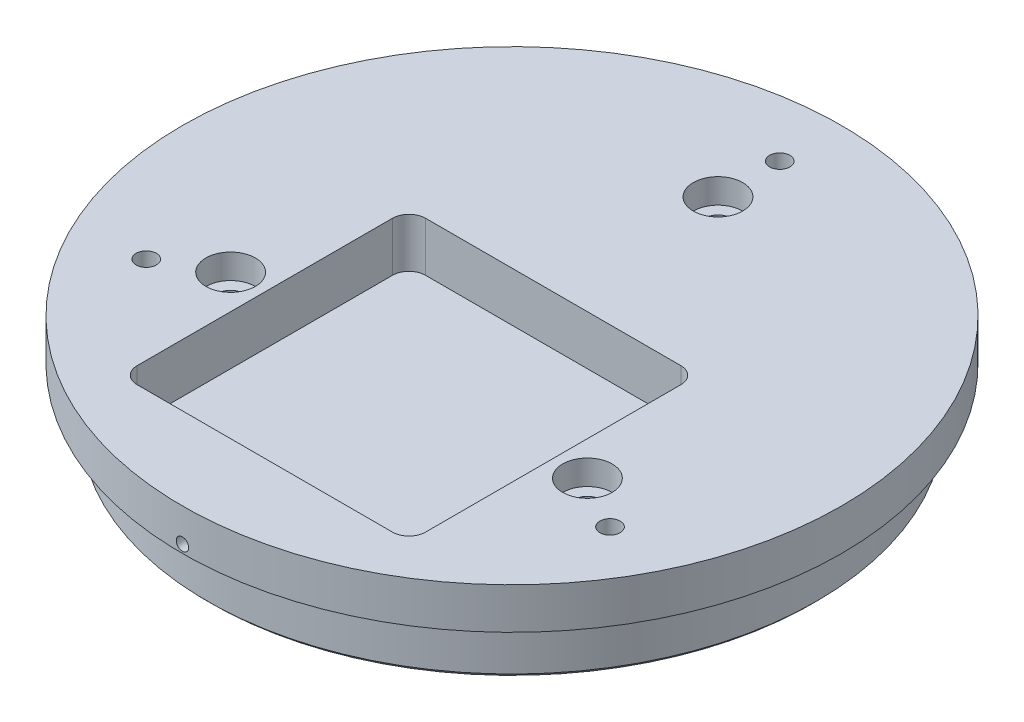
ISO-10303-21;
HEADER;
FILE_DESCRIPTION(('STEP AP214'),'2;1');
FILE_NAME('part.step','',(''),(''),'','','');
FILE_SCHEMA(('AUTOMOTIVE_DESIGN { 1 0 10303 214 1 1 1 1 }'));
ENDSEC;
DATA;
#1=APPLICATION_CONTEXT('core data for automotive mechanical design processes');
#2=APPLICATION_PROTOCOL_DEFINITION('international standard','automotive_design',2000,#1);
#3=PRODUCT_CONTEXT('',#1,'mechanical');
#4=PRODUCT('Part','Part','',(#3));
#5=PRODUCT_RELATED_PRODUCT_CATEGORY('part','',(#4));
#6=PRODUCT_DEFINITION_FORMATION('','',#4);
#7=PRODUCT_DEFINITION_CONTEXT('part definition',#1,'design');
#8=PRODUCT_DEFINITION('design','',#6,#7);
#9=PRODUCT_DEFINITION_SHAPE('','',#8);
#10=(LENGTH_UNIT() NAMED_UNIT(*) SI_UNIT(.MILLI.,.METRE.));
#11=(NAMED_UNIT(*) PLANE_ANGLE_UNIT() SI_UNIT($,.RADIAN.));
#12=(NAMED_UNIT(*) SI_UNIT($,.STERADIAN.) SOLID_ANGLE_UNIT());
#13=UNCERTAINTY_MEASURE_WITH_UNIT(LENGTH_MEASURE(1.E-05),#10,'distance_accuracy_value','');
#14=(GEOMETRIC_REPRESENTATION_CONTEXT(3) GLOBAL_UNCERTAINTY_ASSIGNED_CONTEXT((#13)) GLOBAL_UNIT_ASSIGNED_CONTEXT((#10,
#11,#12)) REPRESENTATION_CONTEXT('',''));
#15=CARTESIAN_POINT('',(0.,0.,0.));
#16=DIRECTION('',(0.,0.,1.));
#17=DIRECTION('',(1.,0.,0.));
#18=AXIS2_PLACEMENT_3D('',#15,#16,#17);
#19=CARTESIAN_POINT('',(-13.3000000000007,2.00000000069167,26.7499999999995));
#20=DIRECTION('',(0.,1.,0.));
#21=DIRECTION('',(-1.,0.,0.));
#22=AXIS2_PLACEMENT_3D('',#19,#20,#21);
#23=CONICAL_SURFACE('',#22,1.22949999949616,1.02974425750673);
#24=CARTESIAN_POINT('',(-13.3000000000152,1.26124186795096,26.7499999999995));
#25=VERTEX_POINT('',#24);
#26=VERTEX_LOOP('',#25);
#27=FACE_BOUND('',#26,.T.);
#28=CARTESIAN_POINT('',(-13.3000000000007,1.99999999999998,26.7499999999995));
#29=DIRECTION('',(0.,1.,0.));
#30=DIRECTION('',(-1.,0.,0.));
#31=AXIS2_PLACEMENT_3D('',#28,#29,#30);
#32=CIRCLE('',#31,1.2295);
#33=CARTESIAN_POINT('',(-14.5295000000007,1.99999999999998,26.7499999999995));
#34=VERTEX_POINT('',#33);
#35=EDGE_CURVE('E108',#34,#34,#32,.T.);
#36=ORIENTED_EDGE('',*,*,#35,.T.);
#37=EDGE_LOOP('',(#36));
#38=FACE_BOUND('',#37,.T.);
#39=ADVANCED_FACE('F17',(#27,#38),#23,.F.);
#40=CARTESIAN_POINT('',(13.3000000000008,2.00000000069167,-1.85000000000093));
#41=DIRECTION('',(0.,1.,0.));
#42=DIRECTION('',(-1.,0.,0.));
#43=AXIS2_PLACEMENT_3D('',#40,#41,#42);
#44=CONICAL_SURFACE('',#43,1.22949999958183,1.02974425750354);
#45=CARTESIAN_POINT('',(13.3000000000152,1.26124186789411,-1.85000000000093));
#46=VERTEX_POINT('',#45);
#47=VERTEX_LOOP('',#46);
#48=FACE_BOUND('',#47,.T.);
#49=CARTESIAN_POINT('',(13.3000000000008,1.99999999999999,-1.85000000000093));
#50=DIRECTION('',(0.,1.,0.));
#51=DIRECTION('',(-1.,0.,0.));
#52=AXIS2_PLACEMENT_3D('',#49,#50,#51);
#53=CIRCLE('',#52,1.2295);
#54=CARTESIAN_POINT('',(12.0705000000008,1.99999999999999,-1.85000000000093));
#55=VERTEX_POINT('',#54);
#56=EDGE_CURVE('E110',#55,#55,#53,.T.);
#57=ORIENTED_EDGE('',*,*,#56,.T.);
#58=EDGE_LOOP('',(#57));
#59=FACE_BOUND('',#58,.T.);
#60=ADVANCED_FACE('F105',(#48,#59),#44,.F.);
#61=CARTESIAN_POINT('',(-13.3000000000007,3.99999999999998,26.7499999999995));
#62=DIRECTION('',(0.,1.,0.));
#63=DIRECTION('',(-1.,0.,0.));
#64=AXIS2_PLACEMENT_3D('',#61,#62,#63);
#65=CYLINDRICAL_SURFACE('',#64,1.2295);
#66=ORIENTED_EDGE('',*,*,#35,.F.);
#67=EDGE_LOOP('',(#66));
#68=FACE_BOUND('',#67,.T.);
#69=CARTESIAN_POINT('',(-13.3000000000007,5.99999999999998,26.7499999999995));
#70=DIRECTION('',(0.,1.,0.));
#71=DIRECTION('',(-1.,0.,0.));
#72=AXIS2_PLACEMENT_3D('',#69,#70,#71);
#73=CIRCLE('',#72,1.2295);
#74=CARTESIAN_POINT('',(-14.5295000000007,5.99999999999998,26.7499999999995));
#75=VERTEX_POINT('',#74);
#76=EDGE_CURVE('E20',#75,#75,#73,.F.);
#77=ORIENTED_EDGE('',*,*,#76,.F.);
#78=EDGE_LOOP('',(#77));
#79=FACE_BOUND('',#78,.T.);
#80=ADVANCED_FACE('F410',(#68,#79),#65,.F.);
#81=CARTESIAN_POINT('',(13.3000000000008,3.99999999999999,-1.85000000000093));
#82=DIRECTION('',(0.,1.,0.));
#83=DIRECTION('',(-1.,0.,0.));
#84=AXIS2_PLACEMENT_3D('',#81,#82,#83);
#85=CYLINDRICAL_SURFACE('',#84,1.2295);
#86=ORIENTED_EDGE('',*,*,#56,.F.);
#87=EDGE_LOOP('',(#86));
#88=FACE_BOUND('',#87,.T.);
#89=CARTESIAN_POINT('',(13.3000000000008,5.99999999999999,-1.85000000000093));
#90=DIRECTION('',(0.,1.,0.));
#91=DIRECTION('',(-1.,0.,0.));
#92=AXIS2_PLACEMENT_3D('',#89,#90,#91);
#93=CIRCLE('',#92,1.2295);
#94=CARTESIAN_POINT('',(12.0705000000008,5.99999999999999,-1.85000000000093));
#95=VERTEX_POINT('',#94);
#96=EDGE_CURVE('E393',#95,#95,#93,.F.);
#97=ORIENTED_EDGE('',*,*,#96,.F.);
#98=EDGE_LOOP('',(#97));
#99=FACE_BOUND('',#98,.T.);
#100=ADVANCED_FACE('F412',(#88,#99),#85,.F.);
#101=CARTESIAN_POINT('',(28.1458256229943,4.00000000070122,16.25));
#102=DIRECTION('',(0.,1.,0.));
#103=DIRECTION('',(-1.,0.,0.));
#104=AXIS2_PLACEMENT_3D('',#101,#102,#103);
#105=CONICAL_SURFACE('',#104,1.22949999954438,1.02974425746656);
#106=CARTESIAN_POINT('',(28.1458256229143,3.26124186790366,16.25));
#107=VERTEX_POINT('',#106);
#108=VERTEX_LOOP('',#107);
#109=FACE_BOUND('',#108,.T.);
#110=CARTESIAN_POINT('',(28.1458256229943,3.99999999999999,16.25));
#111=DIRECTION('',(0.,1.,0.));
#112=DIRECTION('',(-1.,0.,0.));
#113=AXIS2_PLACEMENT_3D('',#110,#111,#112);
#114=CIRCLE('',#113,1.2295);
#115=CARTESIAN_POINT('',(26.9163256229943,3.99999999999999,16.25));
#116=VERTEX_POINT('',#115);
#117=EDGE_CURVE('E388',#116,#116,#114,.T.);
#118=ORIENTED_EDGE('',*,*,#117,.T.);
#119=EDGE_LOOP('',(#118));
#120=FACE_BOUND('',#119,.T.);
#121=ADVANCED_FACE('F418',(#109,#120),#105,.F.);
#122=CARTESIAN_POINT('',(-28.1458256229943,4.00000000075806,16.25));
#123=DIRECTION('',(0.,1.,0.));
#124=DIRECTION('',(-1.,0.,0.));
#125=AXIS2_PLACEMENT_3D('',#122,#123,#124);
#126=CONICAL_SURFACE('',#125,1.22949999959052,1.02974425746957);
#127=CARTESIAN_POINT('',(-28.1458256229712,3.26124186790366,16.25));
#128=VERTEX_POINT('',#127);
#129=VERTEX_LOOP('',#128);
#130=FACE_BOUND('',#129,.T.);
#131=CARTESIAN_POINT('',(-28.1458256229943,3.99999999999998,16.25));
#132=DIRECTION('',(0.,1.,0.));
#133=DIRECTION('',(-1.,0.,0.));
#134=AXIS2_PLACEMENT_3D('',#131,#132,#133);
#135=CIRCLE('',#134,1.2295);
#136=CARTESIAN_POINT('',(-29.3753256229943,3.99999999999998,16.25));
#137=VERTEX_POINT('',#136);
#138=EDGE_CURVE('E383',#137,#137,#135,.T.);
#139=ORIENTED_EDGE('',*,*,#138,.T.);
#140=EDGE_LOOP('',(#139));
#141=FACE_BOUND('',#140,.T.);
#142=ADVANCED_FACE('F424',(#130,#141),#126,.F.);
#143=CARTESIAN_POINT('',(0.,4.00000000064438,-32.5));
#144=DIRECTION('',(0.,1.,0.));
#145=DIRECTION('',(-1.,0.,0.));
#146=AXIS2_PLACEMENT_3D('',#143,#144,#145);
#147=CONICAL_SURFACE('',#146,1.22949999945378,1.02974425747629);
#148=CARTESIAN_POINT('',(-5.6843418860808E-11,3.26124186790366,-32.5));
#149=VERTEX_POINT('',#148);
#150=VERTEX_LOOP('',#149);
#151=FACE_BOUND('',#150,.T.);
#152=CARTESIAN_POINT('',(0.,3.99999999999999,-32.5));
#153=DIRECTION('',(0.,1.,0.));
#154=DIRECTION('',(-1.,0.,0.));
#155=AXIS2_PLACEMENT_3D('',#152,#153,#154);
#156=CIRCLE('',#155,1.2295);
#157=CARTESIAN_POINT('',(-1.22950000000001,3.99999999999999,-32.5));
#158=VERTEX_POINT('',#157);
#159=EDGE_CURVE('E380',#158,#158,#156,.T.);
#160=ORIENTED_EDGE('',*,*,#159,.T.);
#161=EDGE_LOOP('',(#160));
#162=FACE_BOUND('',#161,.T.);
#163=ADVANCED_FACE('F428',(#151,#162),#147,.F.);
#164=CARTESIAN_POINT('',(0.,5.99999999999999,12.5));
#165=DIRECTION('',(0.,1.,0.));
#166=DIRECTION('',(0.,0.,1.));
#167=AXIS2_PLACEMENT_3D('',#164,#165,#166);
#168=PLANE('',#167);
#169=ORIENTED_EDGE('',*,*,#96,.T.);
#170=EDGE_LOOP('',(#169));
#171=FACE_BOUND('',#170,.T.);
#172=ORIENTED_EDGE('',*,*,#76,.T.);
#173=EDGE_LOOP('',(#172));
#174=FACE_BOUND('',#173,.T.);
#175=CARTESIAN_POINT('',(-15.5,5.99999999999998,-3.));
#176=DIRECTION('',(0.,-1.,0.));
#177=DIRECTION('',(1.,0.,0.));
#178=AXIS2_PLACEMENT_3D('',#175,#176,#177);
#179=CIRCLE('',#178,2.);
#180=CARTESIAN_POINT('',(-15.5,5.99999999999998,-5.));
#181=VERTEX_POINT('',#180);
#182=CARTESIAN_POINT('',(-17.5,5.99999999999998,-3.));
#183=VERTEX_POINT('',#182);
#184=EDGE_CURVE('E367',#181,#183,#179,.F.);
#185=ORIENTED_EDGE('',*,*,#184,.T.);
#186=DIRECTION('',(0.,0.,1.));
#187=VECTOR('',#186,1.);
#188=CARTESIAN_POINT('',(-17.5,5.99999999999998,-5.));
#189=LINE('',#188,#187);
#190=CARTESIAN_POINT('',(-17.5,5.99999999999998,28.));
#191=VERTEX_POINT('',#190);
#192=EDGE_CURVE('E370',#183,#191,#189,.T.);
#193=ORIENTED_EDGE('',*,*,#192,.T.);
#194=CARTESIAN_POINT('',(-15.5,5.99999999999998,28.));
#195=DIRECTION('',(0.,-1.,0.));
#196=DIRECTION('',(1.,0.,0.));
#197=AXIS2_PLACEMENT_3D('',#194,#195,#196);
#198=CIRCLE('',#197,2.);
#199=CARTESIAN_POINT('',(-15.5,5.99999999999998,30.));
#200=VERTEX_POINT('',#199);
#201=EDGE_CURVE('E373',#191,#200,#198,.F.);
#202=ORIENTED_EDGE('',*,*,#201,.T.);
#203=DIRECTION('',(1.,0.,0.));
#204=VECTOR('',#203,1.);
#205=CARTESIAN_POINT('',(-17.5,5.99999999999998,30.));
#206=LINE('',#205,#204);
#207=CARTESIAN_POINT('',(15.5,5.99999999999999,30.));
#208=VERTEX_POINT('',#207);
#209=EDGE_CURVE('E82',#200,#208,#206,.T.);
#210=ORIENTED_EDGE('',*,*,#209,.T.);
#211=CARTESIAN_POINT('',(15.5,5.99999999999999,28.));
#212=DIRECTION('',(0.,-1.,0.));
#213=DIRECTION('',(1.,0.,0.));
#214=AXIS2_PLACEMENT_3D('',#211,#212,#213);
#215=CIRCLE('',#214,2.);
#216=CARTESIAN_POINT('',(17.5,5.99999999999999,28.));
#217=VERTEX_POINT('',#216);
#218=EDGE_CURVE('E379',#208,#217,#215,.F.);
#219=ORIENTED_EDGE('',*,*,#218,.T.);
#220=DIRECTION('',(0.,0.,-1.));
#221=VECTOR('',#220,1.);
#222=CARTESIAN_POINT('',(17.5,5.99999999999999,30.));
#223=LINE('',#222,#221);
#224=CARTESIAN_POINT('',(17.5,5.99999999999999,-3.));
#225=VERTEX_POINT('',#224);
#226=EDGE_CURVE('E88',#217,#225,#223,.T.);
#227=ORIENTED_EDGE('',*,*,#226,.T.);
#228=CARTESIAN_POINT('',(15.5,5.99999999999999,-3.));
#229=DIRECTION('',(0.,-1.,0.));
#230=DIRECTION('',(1.,0.,0.));
#231=AXIS2_PLACEMENT_3D('',#228,#229,#230);
#232=CIRCLE('',#231,2.);
#233=CARTESIAN_POINT('',(15.5,5.99999999999999,-5.));
#234=VERTEX_POINT('',#233);
#235=EDGE_CURVE('E196',#225,#234,#232,.F.);
#236=ORIENTED_EDGE('',*,*,#235,.T.);
#237=DIRECTION('',(-1.,0.,0.));
#238=VECTOR('',#237,1.);
#239=CARTESIAN_POINT('',(17.5,5.99999999999999,-5.));
#240=LINE('',#239,#238);
#241=EDGE_CURVE('E364',#234,#181,#240,.T.);
#242=ORIENTED_EDGE('',*,*,#241,.T.);
#243=EDGE_LOOP('',(#185,#193,#202,#210,#219,#227,#236,#242));
#244=FACE_BOUND('',#243,.T.);
#245=ADVANCED_FACE('F254',(#171,#174,#244),#168,.T.);
#246=CARTESIAN_POINT('',(0.,7.99999999999999,143.771701226623));
#247=DIRECTION('',(0.,0.,-1.));
#248=DIRECTION('',(-1.,0.,0.));
#249=AXIS2_PLACEMENT_3D('',#246,#247,#248);
#250=CYLINDRICAL_SURFACE('',#249,0.75);
#251=CARTESIAN_POINT('',(0.,7.99999999999999,30.));
#252=DIRECTION('',(0.,0.,-1.));
#253=DIRECTION('',(-1.,0.,0.));
#254=AXIS2_PLACEMENT_3D('',#251,#252,#253);
#255=CIRCLE('',#254,0.75);
#256=CARTESIAN_POINT('',(-0.749999999999989,7.99999999999999,30.));
#257=VERTEX_POINT('',#256);
#258=EDGE_CURVE('E374',#257,#257,#255,.T.);
#259=ORIENTED_EDGE('',*,*,#258,.T.);
#260=EDGE_LOOP('',(#259));
#261=FACE_BOUND('',#260,.T.);
#262=CARTESIAN_POINT('',(0.750000000000011,7.99999999999999,39.9929681319104));
#263=CARTESIAN_POINT('',(0.749998133213939,7.9578761436597,39.9929682269283));
#264=CARTESIAN_POINT('',(0.746439251898939,7.91572183778971,39.9930353990875));
#265=CARTESIAN_POINT('',(0.732291706889417,7.83257445013521,39.9932969006481));
#266=CARTESIAN_POINT('',(0.721694606882986,7.79158282354627,39.9934913826444));
#267=CARTESIAN_POINT('',(0.693772650166438,7.71197740628213,39.9939854649549));
#268=CARTESIAN_POINT('',(0.676451037314083,7.67336247949327,39.9942850145785));
#269=CARTESIAN_POINT('',(0.63557628504459,7.59959948481156,39.9949554137855));
#270=CARTESIAN_POINT('',(0.612024684078199,7.56445056395115,39.99532624576));
#271=CARTESIAN_POINT('',(0.559350678938039,7.49859705787877,39.9960975430316));
#272=CARTESIAN_POINT('',(0.53022708112566,7.46789342742155,39.9964980146666));
#273=CARTESIAN_POINT('',(0.4672374432312,7.41180994995799,39.9972833969171));
#274=CARTESIAN_POINT('',(0.433371215976638,7.38643031316704,39.9976683069176));
#275=CARTESIAN_POINT('',(0.361856156531354,7.34171536104787,39.9983791793539));
#276=CARTESIAN_POINT('',(0.32420711643233,7.32238037818207,39.9987051385468));
#277=CARTESIAN_POINT('',(0.246196681468618,7.29030584788635,39.999261332531));
#278=CARTESIAN_POINT('',(0.205835294174277,7.27756628204905,39.9994915675894));
#279=CARTESIAN_POINT('',(0.123550863033674,7.25904560830111,39.9998303342847));
#280=CARTESIAN_POINT('',(0.0816280029123259,7.25326368439506,39.9999388801932));
#281=CARTESIAN_POINT('',(-0.00259343136943597,7.24881991723648,40.0000220794005));
#282=CARTESIAN_POINT('',(-0.0448920045313918,7.25015805506801,39.999996733055));
#283=CARTESIAN_POINT('',(-0.128658619150234,7.25991571150732,39.9998150178543));
#284=CARTESIAN_POINT('',(-0.170126764114988,7.26833434187864,39.9996586654335));
#285=CARTESIAN_POINT('',(-0.251061063886423,7.29201263966743,39.9992325819692));
#286=CARTESIAN_POINT('',(-0.290527215683745,7.30727231736789,39.9989628507552));
#287=CARTESIAN_POINT('',(-0.366340039957383,7.344200557034,39.9983403875958));
#288=CARTESIAN_POINT('',(-0.402686513971973,7.36586952634447,39.9979876503751));
#289=CARTESIAN_POINT('',(-0.471226038384791,7.41500092728512,39.9972389375392));
#290=CARTESIAN_POINT('',(-0.503419086098507,7.4424633626598,39.9968429618961));
#291=CARTESIAN_POINT('',(-0.562743100357051,7.50240717030132,39.9960523363293));
#292=CARTESIAN_POINT('',(-0.589873286409261,7.53488931499973,39.9956576866191));
#293=CARTESIAN_POINT('',(-0.638295433027542,7.60394775233482,39.9949142678206));
#294=CARTESIAN_POINT('',(-0.659587392764567,7.64052404555287,39.9945654987388));
#295=CARTESIAN_POINT('',(-0.695728582466174,7.71673292081368,39.9939531686755));
#296=CARTESIAN_POINT('',(-0.710577788685187,7.75636551412017,39.9936896080081));
#297=CARTESIAN_POINT('',(-0.733411454745622,7.83756175242424,39.993277424549));
#298=CARTESIAN_POINT('',(-0.741395922078039,7.87912539531455,39.993128801632));
#299=CARTESIAN_POINT('',(-0.750272503097044,7.96299709084483,39.9929632726105));
#300=CARTESIAN_POINT('',(-0.751165696829378,8.00530502914012,39.9929463464478));
#301=CARTESIAN_POINT('',(-0.745837188865819,8.08947028526286,39.9930460669925));
#302=CARTESIAN_POINT('',(-0.739615490192567,8.13132760328173,39.9931627136432));
#303=CARTESIAN_POINT('',(-0.720234705041751,8.21340041629698,39.9935164111187));
#304=CARTESIAN_POINT('',(-0.707076108001617,8.25361602690944,39.9937534534488));
#305=CARTESIAN_POINT('',(-0.674195554485228,8.33126737549718,39.9943212114454));
#306=CARTESIAN_POINT('',(-0.654473593362602,8.36870311150449,39.9946519271782));
#307=CARTESIAN_POINT('',(-0.609023368820755,8.43973700784848,39.9953697969474));
#308=CARTESIAN_POINT('',(-0.583294377797462,8.47333470256599,39.9957569578187));
#309=CARTESIAN_POINT('',(-0.526561519516581,8.53573411926785,39.9965440460196));
#310=CARTESIAN_POINT('',(-0.495557645704143,8.56453583529238,39.996943973365));
#311=CARTESIAN_POINT('',(-0.429150498948833,8.61652929722107,39.9977115659066));
#312=CARTESIAN_POINT('',(-0.393746680140799,8.6397203460019,39.9980792270901));
#313=CARTESIAN_POINT('',(-0.319547461169087,8.67982937567322,39.9987407813864));
#314=CARTESIAN_POINT('',(-0.280752066176037,8.69674736612709,39.9990346746116));
#315=CARTESIAN_POINT('',(-0.200873596212271,8.72382882730189,39.9995155417612));
#316=CARTESIAN_POINT('',(-0.159790675325986,8.73399275237181,39.9997025228776));
#317=CARTESIAN_POINT('',(-0.0765011279047528,8.74727906053961,39.99994851501));
#318=CARTESIAN_POINT('',(-0.0342945005199062,8.75040143831157,40.0000075259294));
#319=CARTESIAN_POINT('',(0.0500372893647339,8.7495159476271,39.9999909250995));
#320=CARTESIAN_POINT('',(0.09216246348402,8.74550918495631,39.9999153342281));
#321=CARTESIAN_POINT('',(0.175142166281936,8.73048140949394,39.9996380909941));
#322=CARTESIAN_POINT('',(0.215996692418433,8.71946038267017,39.9994364383792));
#323=CARTESIAN_POINT('',(0.295276199596943,8.69071692174625,39.9989297951255));
#324=CARTESIAN_POINT('',(0.333701136505596,8.67299436595397,39.9986248026102));
#325=CARTESIAN_POINT('',(0.40702901473698,8.63135177025556,39.9979458666621));
#326=CARTESIAN_POINT('',(0.441932090009229,8.60743196617741,39.9975719258532));
#327=CARTESIAN_POINT('',(0.507229459273101,8.55407238309446,39.9967972031897));
#328=CARTESIAN_POINT('',(0.537623533584014,8.52463233529881,39.9963964200287));
#329=CARTESIAN_POINT('',(0.593045704406182,8.46105883044632,39.9956131001452));
#330=CARTESIAN_POINT('',(0.618072467308691,8.42692421038526,39.9952305679759));
#331=CARTESIAN_POINT('',(0.662051347608468,8.35492169507237,39.9945267952041));
#332=CARTESIAN_POINT('',(0.681000153372048,8.31705177925054,39.9942055880535));
#333=CARTESIAN_POINT('',(0.712248994164073,8.23869710294016,39.9936613470126));
#334=CARTESIAN_POINT('',(0.724556983392492,8.19821553601132,39.9934381957332));
#335=CARTESIAN_POINT('',(0.738901727942901,8.13123071739562,39.9931750732697));
#336=CARTESIAN_POINT('',(0.743058369256034,8.10516253928382,39.9930978056761));
#337=CARTESIAN_POINT('',(0.748608089502941,8.05273355254089,39.9929943052551));
#338=CARTESIAN_POINT('',(0.750001168750343,8.02637274394297,39.9929680724219));
#339=CARTESIAN_POINT('',(0.750000000000011,7.99999999999999,39.9929681319104));
#340=B_SPLINE_CURVE_WITH_KNOTS('',3,(#262,#263,#264,#265,#266,#267,#268,#269,#270,#271,#272,
#273,#274,#275,#276,#277,#278,#279,#280,#281,#282,#283,#284,#285,#286,#287,#288,#289,#290,#291,
#292,#293,#294,#295,#296,#297,#298,#299,#300,#301,#302,#303,#304,#305,#306,#307,#308,#309,#310,
#311,#312,#313,#314,#315,#316,#317,#318,#319,#320,#321,#322,#323,#324,#325,#326,#327,#328,#329,
#330,#331,#332,#333,#334,#335,#336,#337,#338,#339),.UNSPECIFIED.,.T.,.F.,(4,2,2,2,2,2,2,2,2,2,2,
2,2,2,2,2,2,2,2,2,2,2,2,2,2,2,2,2,2,2,2,2,2,2,2,2,2,2,4),(0.,0.126275307209662,
0.252702247262346,0.379068275478343,0.505403127596707,0.631765073654805,0.75813200811611,
0.884505891671201,1.01087942252277,1.13723813078415,1.26359650334741,1.38993902681914,
1.51628174020102,1.64263248506532,1.76898331159429,1.89535360035127,2.02172390705319,
2.14809467950463,2.27446531405658,2.40081670119361,2.52716803465244,2.65351045450269,
2.77985296379409,2.9062107843227,3.03256876187143,3.15894243129839,3.28531590806568,
3.411680882772,3.53804595305516,3.66439142483268,3.79073714936804,3.91708516830786,
4.04342837994903,4.16977774507252,4.29615846777645,4.4226079337275,4.54890560361067,
4.62796357718264,4.70702154178256),.UNSPECIFIED.);
#341=CARTESIAN_POINT('',(0.750000000000011,7.99999999999999,39.9929681319104));
#342=VERTEX_POINT('',#341);
#343=EDGE_CURVE('E189',#342,#342,#340,.T.);
#344=ORIENTED_EDGE('',*,*,#343,.F.);
#345=EDGE_LOOP('',(#344));
#346=FACE_BOUND('',#345,.T.);
#347=ADVANCED_FACE('F198',(#261,#346),#250,.F.);
#348=CARTESIAN_POINT('',(28.1458256229943,7.99999999999999,16.25));
#349=DIRECTION('',(0.,1.,0.));
#350=DIRECTION('',(-1.,0.,0.));
#351=AXIS2_PLACEMENT_3D('',#348,#349,#350);
#352=CYLINDRICAL_SURFACE('',#351,1.2295);
#353=ORIENTED_EDGE('',*,*,#117,.F.);
#354=EDGE_LOOP('',(#353));
#355=FACE_BOUND('',#354,.T.);
#356=CARTESIAN_POINT('',(28.1458256229943,12.,16.25));
#357=DIRECTION('',(0.,1.,0.));
#358=DIRECTION('',(-1.,0.,0.));
#359=AXIS2_PLACEMENT_3D('',#356,#357,#358);
#360=CIRCLE('',#359,1.2295);
#361=CARTESIAN_POINT('',(26.9163256229943,12.,16.25));
#362=VERTEX_POINT('',#361);
#363=EDGE_CURVE('E183',#362,#362,#360,.F.);
#364=ORIENTED_EDGE('',*,*,#363,.F.);
#365=EDGE_LOOP('',(#364));
#366=FACE_BOUND('',#365,.T.);
#367=ADVANCED_FACE('F246',(#355,#366),#352,.F.);
#368=CARTESIAN_POINT('',(-28.1458256229943,7.99999999999998,16.25));
#369=DIRECTION('',(0.,1.,0.));
#370=DIRECTION('',(-1.,0.,0.));
#371=AXIS2_PLACEMENT_3D('',#368,#369,#370);
#372=CYLINDRICAL_SURFACE('',#371,1.2295);
#373=ORIENTED_EDGE('',*,*,#138,.F.);
#374=EDGE_LOOP('',(#373));
#375=FACE_BOUND('',#374,.T.);
#376=CARTESIAN_POINT('',(-28.1458256229943,12.,16.25));
#377=DIRECTION('',(0.,1.,0.));
#378=DIRECTION('',(-1.,0.,0.));
#379=AXIS2_PLACEMENT_3D('',#376,#377,#378);
#380=CIRCLE('',#379,1.2295);
#381=CARTESIAN_POINT('',(-29.3753256229943,12.,16.25));
#382=VERTEX_POINT('',#381);
#383=EDGE_CURVE('E180',#382,#382,#380,.F.);
#384=ORIENTED_EDGE('',*,*,#383,.F.);
#385=EDGE_LOOP('',(#384));
#386=FACE_BOUND('',#385,.T.);
#387=ADVANCED_FACE('F243',(#375,#386),#372,.F.);
#388=CARTESIAN_POINT('',(0.,7.99999999999999,-32.5));
#389=DIRECTION('',(0.,1.,0.));
#390=DIRECTION('',(-1.,0.,0.));
#391=AXIS2_PLACEMENT_3D('',#388,#389,#390);
#392=CYLINDRICAL_SURFACE('',#391,1.2295);
#393=ORIENTED_EDGE('',*,*,#159,.F.);
#394=EDGE_LOOP('',(#393));
#395=FACE_BOUND('',#394,.T.);
#396=CARTESIAN_POINT('',(0.,12.,-32.5));
#397=DIRECTION('',(0.,1.,0.));
#398=DIRECTION('',(-1.,0.,0.));
#399=AXIS2_PLACEMENT_3D('',#396,#397,#398);
#400=CIRCLE('',#399,1.2295);
#401=CARTESIAN_POINT('',(-1.22950000000001,12.,-32.5));
#402=VERTEX_POINT('',#401);
#403=EDGE_CURVE('E177',#402,#402,#400,.F.);
#404=ORIENTED_EDGE('',*,*,#403,.F.);
#405=EDGE_LOOP('',(#404));
#406=FACE_BOUND('',#405,.T.);
#407=ADVANCED_FACE('F240',(#395,#406),#392,.F.);
#408=CARTESIAN_POINT('',(17.5,12.,30.));
#409=DIRECTION('',(1.,0.,0.));
#410=DIRECTION('',(0.,0.,-1.));
#411=AXIS2_PLACEMENT_3D('',#408,#409,#410);
#412=PLANE('',#411);
#413=ORIENTED_EDGE('',*,*,#226,.F.);
#414=DIRECTION('',(0.,-1.,0.));
#415=VECTOR('',#414,1.);
#416=CARTESIAN_POINT('',(17.5,12.,28.));
#417=LINE('',#416,#415);
#418=CARTESIAN_POINT('',(17.5,12.,28.));
#419=VERTEX_POINT('',#418);
#420=EDGE_CURVE('E377',#217,#419,#417,.F.);
#421=ORIENTED_EDGE('',*,*,#420,.T.);
#422=DIRECTION('',(0.,0.,1.));
#423=VECTOR('',#422,1.);
#424=CARTESIAN_POINT('',(17.5,12.,0.));
#425=LINE('',#424,#423);
#426=CARTESIAN_POINT('',(17.5,12.,-3.));
#427=VERTEX_POINT('',#426);
#428=EDGE_CURVE('E176',#427,#419,#425,.T.);
#429=ORIENTED_EDGE('',*,*,#428,.F.);
#430=DIRECTION('',(0.,-1.,0.));
#431=VECTOR('',#430,1.);
#432=CARTESIAN_POINT('',(17.5,12.,-3.));
#433=LINE('',#432,#431);
#434=EDGE_CURVE('E360',#427,#225,#433,.T.);
#435=ORIENTED_EDGE('',*,*,#434,.T.);
#436=EDGE_LOOP('',(#413,#421,#429,#435));
#437=FACE_BOUND('',#436,.T.);
#438=ADVANCED_FACE('F236',(#437),#412,.F.);
#439=CARTESIAN_POINT('',(15.5,12.,28.));
#440=DIRECTION('',(0.,-1.,0.));
#441=DIRECTION('',(1.,0.,0.));
#442=AXIS2_PLACEMENT_3D('',#439,#440,#441);
#443=CYLINDRICAL_SURFACE('',#442,2.);
#444=DIRECTION('',(0.,1.,0.));
#445=VECTOR('',#444,1.);
#446=CARTESIAN_POINT('',(15.5,12.,30.));
#447=LINE('',#446,#445);
#448=CARTESIAN_POINT('',(15.5,12.,30.));
#449=VERTEX_POINT('',#448);
#450=EDGE_CURVE('E375',#208,#449,#447,.T.);
#451=ORIENTED_EDGE('',*,*,#450,.T.);
#452=CARTESIAN_POINT('',(15.5,12.,28.));
#453=DIRECTION('',(0.,-1.,0.));
#454=DIRECTION('',(1.,0.,0.));
#455=AXIS2_PLACEMENT_3D('',#452,#453,#454);
#456=CIRCLE('',#455,2.);
#457=EDGE_CURVE('E173',#419,#449,#456,.T.);
#458=ORIENTED_EDGE('',*,*,#457,.F.);
#459=ORIENTED_EDGE('',*,*,#420,.F.);
#460=ORIENTED_EDGE('',*,*,#218,.F.);
#461=EDGE_LOOP('',(#451,#458,#459,#460));
#462=FACE_BOUND('',#461,.T.);
#463=ADVANCED_FACE('F232',(#462),#443,.F.);
#464=CARTESIAN_POINT('',(-17.5,12.,30.));
#465=DIRECTION('',(0.,0.,1.));
#466=DIRECTION('',(1.,0.,0.));
#467=AXIS2_PLACEMENT_3D('',#464,#465,#466);
#468=PLANE('',#467);
#469=ORIENTED_EDGE('',*,*,#258,.F.);
#470=EDGE_LOOP('',(#469));
#471=FACE_BOUND('',#470,.T.);
#472=DIRECTION('',(1.,0.,0.));
#473=VECTOR('',#472,1.);
#474=CARTESIAN_POINT('',(20.,12.,30.));
#475=LINE('',#474,#473);
#476=CARTESIAN_POINT('',(-15.5,12.,30.));
#477=VERTEX_POINT('',#476);
#478=EDGE_CURVE('E172',#449,#477,#475,.F.);
#479=ORIENTED_EDGE('',*,*,#478,.F.);
#480=ORIENTED_EDGE('',*,*,#450,.F.);
#481=ORIENTED_EDGE('',*,*,#209,.F.);
#482=DIRECTION('',(0.,-1.,0.));
#483=VECTOR('',#482,1.);
#484=CARTESIAN_POINT('',(-15.5,12.,30.));
#485=LINE('',#484,#483);
#486=EDGE_CURVE('E371',#200,#477,#485,.F.);
#487=ORIENTED_EDGE('',*,*,#486,.T.);
#488=EDGE_LOOP('',(#479,#480,#481,#487));
#489=FACE_BOUND('',#488,.T.);
#490=ADVANCED_FACE('F228',(#471,#489),#468,.F.);
#491=CARTESIAN_POINT('',(-15.5,12.,28.));
#492=DIRECTION('',(0.,-1.,0.));
#493=DIRECTION('',(1.,0.,0.));
#494=AXIS2_PLACEMENT_3D('',#491,#492,#493);
#495=CYLINDRICAL_SURFACE('',#494,2.);
#496=DIRECTION('',(0.,1.,0.));
#497=VECTOR('',#496,1.);
#498=CARTESIAN_POINT('',(-17.5,12.,28.));
#499=LINE('',#498,#497);
#500=CARTESIAN_POINT('',(-17.5,12.,28.));
#501=VERTEX_POINT('',#500);
#502=EDGE_CURVE('E368',#191,#501,#499,.T.);
#503=ORIENTED_EDGE('',*,*,#502,.T.);
#504=CARTESIAN_POINT('',(-15.5,12.,28.));
#505=DIRECTION('',(0.,-1.,0.));
#506=DIRECTION('',(1.,0.,0.));
#507=AXIS2_PLACEMENT_3D('',#504,#505,#506);
#508=CIRCLE('',#507,2.);
#509=EDGE_CURVE('E169',#477,#501,#508,.T.);
#510=ORIENTED_EDGE('',*,*,#509,.F.);
#511=ORIENTED_EDGE('',*,*,#486,.F.);
#512=ORIENTED_EDGE('',*,*,#201,.F.);
#513=EDGE_LOOP('',(#503,#510,#511,#512));
#514=FACE_BOUND('',#513,.T.);
#515=ADVANCED_FACE('F224',(#514),#495,.F.);
#516=CARTESIAN_POINT('',(-17.5,12.,-5.));
#517=DIRECTION('',(-1.,0.,0.));
#518=DIRECTION('',(0.,0.,1.));
#519=AXIS2_PLACEMENT_3D('',#516,#517,#518);
#520=PLANE('',#519);
#521=ORIENTED_EDGE('',*,*,#192,.F.);
#522=DIRECTION('',(0.,-1.,0.));
#523=VECTOR('',#522,1.);
#524=CARTESIAN_POINT('',(-17.5,12.,-3.));
#525=LINE('',#524,#523);
#526=CARTESIAN_POINT('',(-17.5,12.,-3.));
#527=VERTEX_POINT('',#526);
#528=EDGE_CURVE('E365',#183,#527,#525,.F.);
#529=ORIENTED_EDGE('',*,*,#528,.T.);
#530=DIRECTION('',(0.,0.,1.));
#531=VECTOR('',#530,1.);
#532=CARTESIAN_POINT('',(-17.5,12.,0.));
#533=LINE('',#532,#531);
#534=EDGE_CURVE('E168',#501,#527,#533,.F.);
#535=ORIENTED_EDGE('',*,*,#534,.F.);
#536=ORIENTED_EDGE('',*,*,#502,.F.);
#537=EDGE_LOOP('',(#521,#529,#535,#536));
#538=FACE_BOUND('',#537,.T.);
#539=ADVANCED_FACE('F220',(#538),#520,.F.);
#540=CARTESIAN_POINT('',(-15.5,12.,-3.));
#541=DIRECTION('',(0.,-1.,0.));
#542=DIRECTION('',(1.,0.,0.));
#543=AXIS2_PLACEMENT_3D('',#540,#541,#542);
#544=CYLINDRICAL_SURFACE('',#543,2.);
#545=DIRECTION('',(0.,1.,0.));
#546=VECTOR('',#545,1.);
#547=CARTESIAN_POINT('',(-15.5,12.,-5.));
#548=LINE('',#547,#546);
#549=CARTESIAN_POINT('',(-15.5,12.,-5.));
#550=VERTEX_POINT('',#549);
#551=EDGE_CURVE('E361',#181,#550,#548,.T.);
#552=ORIENTED_EDGE('',*,*,#551,.T.);
#553=CARTESIAN_POINT('',(-15.5,12.,-3.));
#554=DIRECTION('',(0.,-1.,0.));
#555=DIRECTION('',(1.,0.,0.));
#556=AXIS2_PLACEMENT_3D('',#553,#554,#555);
#557=CIRCLE('',#556,2.);
#558=EDGE_CURVE('E165',#527,#550,#557,.T.);
#559=ORIENTED_EDGE('',*,*,#558,.F.);
#560=ORIENTED_EDGE('',*,*,#528,.F.);
#561=ORIENTED_EDGE('',*,*,#184,.F.);
#562=EDGE_LOOP('',(#552,#559,#560,#561));
#563=FACE_BOUND('',#562,.T.);
#564=ADVANCED_FACE('F217',(#563),#544,.F.);
#565=CARTESIAN_POINT('',(17.5,12.,-5.));
#566=DIRECTION('',(0.,0.,-1.));
#567=DIRECTION('',(-1.,0.,0.));
#568=AXIS2_PLACEMENT_3D('',#565,#566,#567);
#569=PLANE('',#568);
#570=DIRECTION('',(1.,0.,0.));
#571=VECTOR('',#570,1.);
#572=CARTESIAN_POINT('',(20.,12.,-5.));
#573=LINE('',#572,#571);
#574=CARTESIAN_POINT('',(15.5,12.,-5.));
#575=VERTEX_POINT('',#574);
#576=EDGE_CURVE('E164',#550,#575,#573,.T.);
#577=ORIENTED_EDGE('',*,*,#576,.F.);
#578=ORIENTED_EDGE('',*,*,#551,.F.);
#579=ORIENTED_EDGE('',*,*,#241,.F.);
#580=DIRECTION('',(0.,-1.,0.));
#581=VECTOR('',#580,1.);
#582=CARTESIAN_POINT('',(15.5,12.,-5.));
#583=LINE('',#582,#581);
#584=EDGE_CURVE('E35',#234,#575,#583,.F.);
#585=ORIENTED_EDGE('',*,*,#584,.T.);
#586=EDGE_LOOP('',(#577,#578,#579,#585));
#587=FACE_BOUND('',#586,.T.);
#588=ADVANCED_FACE('F213',(#587),#569,.F.);
#589=CARTESIAN_POINT('',(15.5,12.,-3.));
#590=DIRECTION('',(0.,-1.,0.));
#591=DIRECTION('',(1.,0.,0.));
#592=AXIS2_PLACEMENT_3D('',#589,#590,#591);
#593=CYLINDRICAL_SURFACE('',#592,2.);
#594=ORIENTED_EDGE('',*,*,#434,.F.);
#595=CARTESIAN_POINT('',(15.5,12.,-3.));
#596=DIRECTION('',(0.,-1.,0.));
#597=DIRECTION('',(1.,0.,0.));
#598=AXIS2_PLACEMENT_3D('',#595,#596,#597);
#599=CIRCLE('',#598,2.);
#600=EDGE_CURVE('E161',#575,#427,#599,.T.);
#601=ORIENTED_EDGE('',*,*,#600,.F.);
#602=ORIENTED_EDGE('',*,*,#584,.F.);
#603=ORIENTED_EDGE('',*,*,#235,.F.);
#604=EDGE_LOOP('',(#594,#601,#602,#603));
#605=FACE_BOUND('',#604,.T.);
#606=ADVANCED_FACE('F208',(#605),#593,.F.);
#607=CARTESIAN_POINT('',(0.,9.49999999999999,0.));
#608=DIRECTION('',(0.,-1.,0.));
#609=DIRECTION('',(1.,0.,0.));
#610=AXIS2_PLACEMENT_3D('',#607,#608,#609);
#611=CYLINDRICAL_SURFACE('',#610,40.);
#612=CARTESIAN_POINT('',(0.,12.,0.));
#613=DIRECTION('',(0.,-1.,0.));
#614=DIRECTION('',(1.,0.,0.));
#615=AXIS2_PLACEMENT_3D('',#612,#613,#614);
#616=CIRCLE('',#615,40.);
#617=CARTESIAN_POINT('',(40.,12.,0.));
#618=VERTEX_POINT('',#617);
#619=EDGE_CURVE('E186',#618,#618,#616,.F.);
#620=ORIENTED_EDGE('',*,*,#619,.F.);
#621=EDGE_LOOP('',(#620));
#622=FACE_BOUND('',#621,.T.);
#623=ORIENTED_EDGE('',*,*,#343,.T.);
#624=EDGE_LOOP('',(#623));
#625=FACE_BOUND('',#624,.T.);
#626=CARTESIAN_POINT('',(0.,6.99999999999999,0.));
#627=DIRECTION('',(0.,-1.,0.));
#628=DIRECTION('',(1.,0.,0.));
#629=AXIS2_PLACEMENT_3D('',#626,#627,#628);
#630=CIRCLE('',#629,40.);
#631=CARTESIAN_POINT('',(40.,7.,0.));
#632=VERTEX_POINT('',#631);
#633=EDGE_CURVE('E158',#632,#632,#630,.T.);
#634=ORIENTED_EDGE('',*,*,#633,.F.);
#635=EDGE_LOOP('',(#634));
#636=FACE_BOUND('',#635,.T.);
#637=ADVANCED_FACE('F202',(#622,#625,#636),#611,.T.);
#638=CARTESIAN_POINT('',(20.,12.,0.));
#639=DIRECTION('',(0.,1.,0.));
#640=DIRECTION('',(0.,0.,1.));
#641=AXIS2_PLACEMENT_3D('',#638,#639,#640);
#642=PLANE('',#641);
#643=ORIENTED_EDGE('',*,*,#576,.T.);
#644=ORIENTED_EDGE('',*,*,#600,.T.);
#645=ORIENTED_EDGE('',*,*,#428,.T.);
#646=ORIENTED_EDGE('',*,*,#457,.T.);
#647=ORIENTED_EDGE('',*,*,#478,.T.);
#648=ORIENTED_EDGE('',*,*,#509,.T.);
#649=ORIENTED_EDGE('',*,*,#534,.T.);
#650=ORIENTED_EDGE('',*,*,#558,.T.);
#651=EDGE_LOOP('',(#643,#644,#645,#646,#647,#648,#649,#650));
#652=FACE_BOUND('',#651,.T.);
#653=CARTESIAN_POINT('',(-21.650635094611,12.,12.5));
#654=DIRECTION('',(0.,1.,0.));
#655=DIRECTION('',(-1.,0.,0.));
#656=AXIS2_PLACEMENT_3D('',#653,#654,#655);
#657=CIRCLE('',#656,3.);
#658=CARTESIAN_POINT('',(-24.650635094611,12.,12.5));
#659=VERTEX_POINT('',#658);
#660=EDGE_CURVE('E155',#659,#659,#657,.F.);
#661=ORIENTED_EDGE('',*,*,#660,.T.);
#662=EDGE_LOOP('',(#661));
#663=FACE_BOUND('',#662,.T.);
#664=CARTESIAN_POINT('',(21.650635094611,12.,12.5));
#665=DIRECTION('',(0.,1.,0.));
#666=DIRECTION('',(-1.,0.,0.));
#667=AXIS2_PLACEMENT_3D('',#664,#665,#666);
#668=CIRCLE('',#667,3.);
#669=CARTESIAN_POINT('',(18.650635094611,12.,12.5));
#670=VERTEX_POINT('',#669);
#671=EDGE_CURVE('E152',#670,#670,#668,.F.);
#672=ORIENTED_EDGE('',*,*,#671,.T.);
#673=EDGE_LOOP('',(#672));
#674=FACE_BOUND('',#673,.T.);
#675=CARTESIAN_POINT('',(0.,12.,-25.));
#676=DIRECTION('',(0.,1.,0.));
#677=DIRECTION('',(-1.,0.,0.));
#678=AXIS2_PLACEMENT_3D('',#675,#676,#677);
#679=CIRCLE('',#678,3.);
#680=CARTESIAN_POINT('',(-3.,12.,-25.));
#681=VERTEX_POINT('',#680);
#682=EDGE_CURVE('E149',#681,#681,#679,.F.);
#683=ORIENTED_EDGE('',*,*,#682,.T.);
#684=EDGE_LOOP('',(#683));
#685=FACE_BOUND('',#684,.T.);
#686=ORIENTED_EDGE('',*,*,#403,.T.);
#687=EDGE_LOOP('',(#686));
#688=FACE_BOUND('',#687,.T.);
#689=ORIENTED_EDGE('',*,*,#383,.T.);
#690=EDGE_LOOP('',(#689));
#691=FACE_BOUND('',#690,.T.);
#692=ORIENTED_EDGE('',*,*,#363,.T.);
#693=EDGE_LOOP('',(#692));
#694=FACE_BOUND('',#693,.T.);
#695=ORIENTED_EDGE('',*,*,#619,.T.);
#696=EDGE_LOOP('',(#695));
#697=FACE_BOUND('',#696,.T.);
#698=ADVANCED_FACE('F207',(#652,#663,#674,#685,#688,#691,#694,#697),#642,.T.);
#699=CARTESIAN_POINT('',(38.5,7.,0.));
#700=DIRECTION('',(0.,-1.,0.));
#701=DIRECTION('',(0.,0.,-1.));
#702=AXIS2_PLACEMENT_3D('',#699,#700,#701);
#703=PLANE('',#702);
#704=CARTESIAN_POINT('',(0.,6.99999999999999,0.));
#705=DIRECTION('',(0.,-1.,0.));
#706=DIRECTION('',(1.,0.,0.));
#707=AXIS2_PLACEMENT_3D('',#704,#705,#706);
#708=CIRCLE('',#707,37.);
#709=CARTESIAN_POINT('',(37.,7.,0.));
#710=VERTEX_POINT('',#709);
#711=EDGE_CURVE('E146',#710,#710,#708,.T.);
#712=ORIENTED_EDGE('',*,*,#711,.F.);
#713=EDGE_LOOP('',(#712));
#714=FACE_BOUND('',#713,.T.);
#715=ORIENTED_EDGE('',*,*,#633,.T.);
#716=EDGE_LOOP('',(#715));
#717=FACE_BOUND('',#716,.T.);
#718=ADVANCED_FACE('F308',(#714,#717),#703,.T.);
#719=CARTESIAN_POINT('',(-21.650635094611,10.5,12.5));
#720=DIRECTION('',(0.,1.,0.));
#721=DIRECTION('',(-1.,0.,0.));
#722=AXIS2_PLACEMENT_3D('',#719,#720,#721);
#723=CYLINDRICAL_SURFACE('',#722,3.);
#724=CARTESIAN_POINT('',(-21.650635094611,8.99999999999998,12.5));
#725=DIRECTION('',(0.,1.,0.));
#726=DIRECTION('',(-1.,0.,0.));
#727=AXIS2_PLACEMENT_3D('',#724,#725,#726);
#728=CIRCLE('',#727,3.);
#729=CARTESIAN_POINT('',(-24.650635094611,8.99999999999998,12.5));
#730=VERTEX_POINT('',#729);
#731=EDGE_CURVE('E143',#730,#730,#728,.T.);
#732=ORIENTED_EDGE('',*,*,#731,.F.);
#733=EDGE_LOOP('',(#732));
#734=FACE_BOUND('',#733,.T.);
#735=ORIENTED_EDGE('',*,*,#660,.F.);
#736=EDGE_LOOP('',(#735));
#737=FACE_BOUND('',#736,.T.);
#738=ADVANCED_FACE('F305',(#734,#737),#723,.F.);
#739=CARTESIAN_POINT('',(21.650635094611,10.5,12.5));
#740=DIRECTION('',(0.,1.,0.));
#741=DIRECTION('',(-1.,0.,0.));
#742=AXIS2_PLACEMENT_3D('',#739,#740,#741);
#743=CYLINDRICAL_SURFACE('',#742,3.);
#744=CARTESIAN_POINT('',(21.650635094611,8.99999999999999,12.5));
#745=DIRECTION('',(0.,1.,0.));
#746=DIRECTION('',(-1.,0.,0.));
#747=AXIS2_PLACEMENT_3D('',#744,#745,#746);
#748=CIRCLE('',#747,3.);
#749=CARTESIAN_POINT('',(18.650635094611,8.99999999999999,12.5));
#750=VERTEX_POINT('',#749);
#751=EDGE_CURVE('E140',#750,#750,#748,.T.);
#752=ORIENTED_EDGE('',*,*,#751,.F.);
#753=EDGE_LOOP('',(#752));
#754=FACE_BOUND('',#753,.T.);
#755=ORIENTED_EDGE('',*,*,#671,.F.);
#756=EDGE_LOOP('',(#755));
#757=FACE_BOUND('',#756,.T.);
#758=ADVANCED_FACE('F301',(#754,#757),#743,.F.);
#759=CARTESIAN_POINT('',(0.,10.5,-25.));
#760=DIRECTION('',(0.,1.,0.));
#761=DIRECTION('',(-1.,0.,0.));
#762=AXIS2_PLACEMENT_3D('',#759,#760,#761);
#763=CYLINDRICAL_SURFACE('',#762,3.);
#764=CARTESIAN_POINT('',(0.,8.99999999999999,-25.));
#765=DIRECTION('',(0.,1.,0.));
#766=DIRECTION('',(-1.,0.,0.));
#767=AXIS2_PLACEMENT_3D('',#764,#765,#766);
#768=CIRCLE('',#767,3.);
#769=CARTESIAN_POINT('',(-3.,8.99999999999999,-25.));
#770=VERTEX_POINT('',#769);
#771=EDGE_CURVE('E137',#770,#770,#768,.T.);
#772=ORIENTED_EDGE('',*,*,#771,.F.);
#773=EDGE_LOOP('',(#772));
#774=FACE_BOUND('',#773,.T.);
#775=ORIENTED_EDGE('',*,*,#682,.F.);
#776=EDGE_LOOP('',(#775));
#777=FACE_BOUND('',#776,.T.);
#778=ADVANCED_FACE('F297',(#774,#777),#763,.F.);
#779=CARTESIAN_POINT('',(0.,3.49999999999999,0.));
#780=DIRECTION('',(0.,-1.,0.));
#781=DIRECTION('',(1.,0.,0.));
#782=AXIS2_PLACEMENT_3D('',#779,#780,#781);
#783=CYLINDRICAL_SURFACE('',#782,37.);
#784=CARTESIAN_POINT('',(0.,0.500000000224356,0.));
#785=DIRECTION('',(0.,1.,0.));
#786=DIRECTION('',(-1.,0.,0.));
#787=AXIS2_PLACEMENT_3D('',#784,#785,#786);
#788=CIRCLE('',#787,36.9999999997756);
#789=CARTESIAN_POINT('',(-36.9999999997756,0.500000000224342,0.));
#790=VERTEX_POINT('',#789);
#791=EDGE_CURVE('E136',#790,#790,#788,.F.);
#792=ORIENTED_EDGE('',*,*,#791,.F.);
#793=EDGE_LOOP('',(#792));
#794=FACE_BOUND('',#793,.T.);
#795=ORIENTED_EDGE('',*,*,#711,.T.);
#796=EDGE_LOOP('',(#795));
#797=FACE_BOUND('',#796,.T.);
#798=ADVANCED_FACE('F293',(#794,#797),#783,.T.);
#799=CARTESIAN_POINT('',(-21.650635094611,8.99999999999998,12.5));
#800=DIRECTION('',(0.,1.,0.));
#801=DIRECTION('',(0.,0.,1.));
#802=AXIS2_PLACEMENT_3D('',#799,#800,#801);
#803=PLANE('',#802);
#804=CARTESIAN_POINT('',(-21.650635094611,8.99999999999997,12.5));
#805=DIRECTION('',(0.,1.,0.));
#806=DIRECTION('',(-1.,0.,0.));
#807=AXIS2_PLACEMENT_3D('',#804,#805,#806);
#808=CIRCLE('',#807,1.55);
#809=CARTESIAN_POINT('',(-23.200635094611,8.99999999999997,12.5));
#810=VERTEX_POINT('',#809);
#811=EDGE_CURVE('E133',#810,#810,#808,.F.);
#812=ORIENTED_EDGE('',*,*,#811,.T.);
#813=EDGE_LOOP('',(#812));
#814=FACE_BOUND('',#813,.T.);
#815=ORIENTED_EDGE('',*,*,#731,.T.);
#816=EDGE_LOOP('',(#815));
#817=FACE_BOUND('',#816,.T.);
#818=ADVANCED_FACE('F289',(#814,#817),#803,.T.);
#819=CARTESIAN_POINT('',(21.650635094611,8.99999999999999,12.5));
#820=DIRECTION('',(0.,1.,0.));
#821=DIRECTION('',(0.,0.,1.));
#822=AXIS2_PLACEMENT_3D('',#819,#820,#821);
#823=PLANE('',#822);
#824=CARTESIAN_POINT('',(21.650635094611,8.99999999999998,12.5));
#825=DIRECTION('',(0.,1.,0.));
#826=DIRECTION('',(-1.,0.,0.));
#827=AXIS2_PLACEMENT_3D('',#824,#825,#826);
#828=CIRCLE('',#827,1.55);
#829=CARTESIAN_POINT('',(20.100635094611,8.99999999999998,12.5));
#830=VERTEX_POINT('',#829);
#831=EDGE_CURVE('E130',#830,#830,#828,.F.);
#832=ORIENTED_EDGE('',*,*,#831,.T.);
#833=EDGE_LOOP('',(#832));
#834=FACE_BOUND('',#833,.T.);
#835=ORIENTED_EDGE('',*,*,#751,.T.);
#836=EDGE_LOOP('',(#835));
#837=FACE_BOUND('',#836,.T.);
#838=ADVANCED_FACE('F285',(#834,#837),#823,.T.);
#839=CARTESIAN_POINT('',(0.,8.99999999999999,-25.));
#840=DIRECTION('',(0.,1.,0.));
#841=DIRECTION('',(0.,0.,1.));
#842=AXIS2_PLACEMENT_3D('',#839,#840,#841);
#843=PLANE('',#842);
#844=CARTESIAN_POINT('',(0.,8.99999999999998,-25.));
#845=DIRECTION('',(0.,1.,0.));
#846=DIRECTION('',(-1.,0.,0.));
#847=AXIS2_PLACEMENT_3D('',#844,#845,#846);
#848=CIRCLE('',#847,1.55);
#849=CARTESIAN_POINT('',(-1.55,8.99999999999998,-25.));
#850=VERTEX_POINT('',#849);
#851=EDGE_CURVE('E127',#850,#850,#848,.F.);
#852=ORIENTED_EDGE('',*,*,#851,.T.);
#853=EDGE_LOOP('',(#852));
#854=FACE_BOUND('',#853,.T.);
#855=ORIENTED_EDGE('',*,*,#771,.T.);
#856=EDGE_LOOP('',(#855));
#857=FACE_BOUND('',#856,.T.);
#858=ADVANCED_FACE('F281',(#854,#857),#843,.T.);
#859=CARTESIAN_POINT('',(0.,0.500000000224347,0.));
#860=DIRECTION('',(0.,1.,0.));
#861=DIRECTION('',(-1.,0.,0.));
#862=AXIS2_PLACEMENT_3D('',#859,#860,#861);
#863=CONICAL_SURFACE('',#862,36.9999999997756,0.785398162499997);
#864=CARTESIAN_POINT('',(0.,-2.24368267021102E-10,0.));
#865=DIRECTION('',(0.,1.,0.));
#866=DIRECTION('',(-1.,0.,0.));
#867=AXIS2_PLACEMENT_3D('',#864,#865,#866);
#868=CIRCLE('',#867,36.5000000002244);
#869=CARTESIAN_POINT('',(-36.5000000002244,-2.24379497304416E-10,0.));
#870=VERTEX_POINT('',#869);
#871=EDGE_CURVE('E124',#870,#870,#868,.F.);
#872=ORIENTED_EDGE('',*,*,#871,.F.);
#873=EDGE_LOOP('',(#872));
#874=FACE_BOUND('',#873,.T.);
#875=ORIENTED_EDGE('',*,*,#791,.T.);
#876=EDGE_LOOP('',(#875));
#877=FACE_BOUND('',#876,.T.);
#878=ADVANCED_FACE('F277',(#874,#877),#863,.T.);
#879=CARTESIAN_POINT('',(-21.6506350946109,-101.771701226623,12.5));
#880=DIRECTION('',(0.,1.,0.));
#881=DIRECTION('',(-1.,0.,0.));
#882=AXIS2_PLACEMENT_3D('',#879,#880,#881);
#883=CYLINDRICAL_SURFACE('',#882,1.55);
#884=ORIENTED_EDGE('',*,*,#811,.F.);
#885=EDGE_LOOP('',(#884));
#886=FACE_BOUND('',#885,.T.);
#887=CARTESIAN_POINT('',(-21.650635094611,0.,12.5));
#888=DIRECTION('',(0.,1.,0.));
#889=DIRECTION('',(-1.,0.,0.));
#890=AXIS2_PLACEMENT_3D('',#887,#888,#889);
#891=CIRCLE('',#890,1.55);
#892=CARTESIAN_POINT('',(-23.200635094611,0.,12.5));
#893=VERTEX_POINT('',#892);
#894=EDGE_CURVE('E121',#893,#893,#891,.T.);
#895=ORIENTED_EDGE('',*,*,#894,.F.);
#896=EDGE_LOOP('',(#895));
#897=FACE_BOUND('',#896,.T.);
#898=ADVANCED_FACE('F273',(#886,#897),#883,.F.);
#899=CARTESIAN_POINT('',(21.650635094611,-101.771701226623,12.5));
#900=DIRECTION('',(0.,1.,0.));
#901=DIRECTION('',(-1.,0.,0.));
#902=AXIS2_PLACEMENT_3D('',#899,#900,#901);
#903=CYLINDRICAL_SURFACE('',#902,1.55);
#904=ORIENTED_EDGE('',*,*,#831,.F.);
#905=EDGE_LOOP('',(#904));
#906=FACE_BOUND('',#905,.T.);
#907=CARTESIAN_POINT('',(21.650635094611,0.,12.5));
#908=DIRECTION('',(0.,1.,0.));
#909=DIRECTION('',(-1.,0.,0.));
#910=AXIS2_PLACEMENT_3D('',#907,#908,#909);
#911=CIRCLE('',#910,1.55);
#912=CARTESIAN_POINT('',(20.100635094611,0.,12.5));
#913=VERTEX_POINT('',#912);
#914=EDGE_CURVE('E26',#913,#913,#911,.T.);
#915=ORIENTED_EDGE('',*,*,#914,.F.);
#916=EDGE_LOOP('',(#915));
#917=FACE_BOUND('',#916,.T.);
#918=ADVANCED_FACE('F266',(#906,#917),#903,.F.);
#919=CARTESIAN_POINT('',(0.,-101.771701226623,-25.));
#920=DIRECTION('',(0.,1.,0.));
#921=DIRECTION('',(-1.,0.,0.));
#922=AXIS2_PLACEMENT_3D('',#919,#920,#921);
#923=CYLINDRICAL_SURFACE('',#922,1.55);
#924=ORIENTED_EDGE('',*,*,#851,.F.);
#925=EDGE_LOOP('',(#924));
#926=FACE_BOUND('',#925,.T.);
#927=CARTESIAN_POINT('',(0.,0.,-25.));
#928=DIRECTION('',(0.,1.,0.));
#929=DIRECTION('',(-1.,0.,0.));
#930=AXIS2_PLACEMENT_3D('',#927,#928,#929);
#931=CIRCLE('',#930,1.55);
#932=CARTESIAN_POINT('',(-1.54999999999999,0.,-25.));
#933=VERTEX_POINT('',#932);
#934=EDGE_CURVE('E11',#933,#933,#931,.T.);
#935=ORIENTED_EDGE('',*,*,#934,.F.);
#936=EDGE_LOOP('',(#935));
#937=FACE_BOUND('',#936,.T.);
#938=ADVANCED_FACE('F260',(#926,#937),#923,.F.);
#939=CARTESIAN_POINT('',(18.5,0.,0.));
#940=DIRECTION('',(0.,-1.,0.));
#941=DIRECTION('',(0.,0.,-1.));
#942=AXIS2_PLACEMENT_3D('',#939,#940,#941);
#943=PLANE('',#942);
#944=ORIENTED_EDGE('',*,*,#934,.T.);
#945=EDGE_LOOP('',(#944));
#946=FACE_BOUND('',#945,.T.);
#947=ORIENTED_EDGE('',*,*,#914,.T.);
#948=EDGE_LOOP('',(#947));
#949=FACE_BOUND('',#948,.T.);
#950=ORIENTED_EDGE('',*,*,#894,.T.);
#951=EDGE_LOOP('',(#950));
#952=FACE_BOUND('',#951,.T.);
#953=ORIENTED_EDGE('',*,*,#871,.T.);
#954=EDGE_LOOP('',(#953));
#955=FACE_BOUND('',#954,.T.);
#956=ADVANCED_FACE('F258',(#946,#949,#952,#955),#943,.T.);
#957=CLOSED_SHELL('',(#39,#60,#80,#100,#121,#142,#163,#245,#347,#367,#387,#407,#438,#463,#490,
#515,#539,#564,#588,#606,#637,#698,#718,#738,#758,#778,#798,#818,#838,#858,#878,#898,#918,#938,#956));
#958=MANIFOLD_SOLID_BREP('B1',#957);
#959=ADVANCED_BREP_SHAPE_REPRESENTATION('',(#18,#958),#14);
#960=SHAPE_DEFINITION_REPRESENTATION(#9,#959);
ENDSEC;
END-ISO-10303-21;
